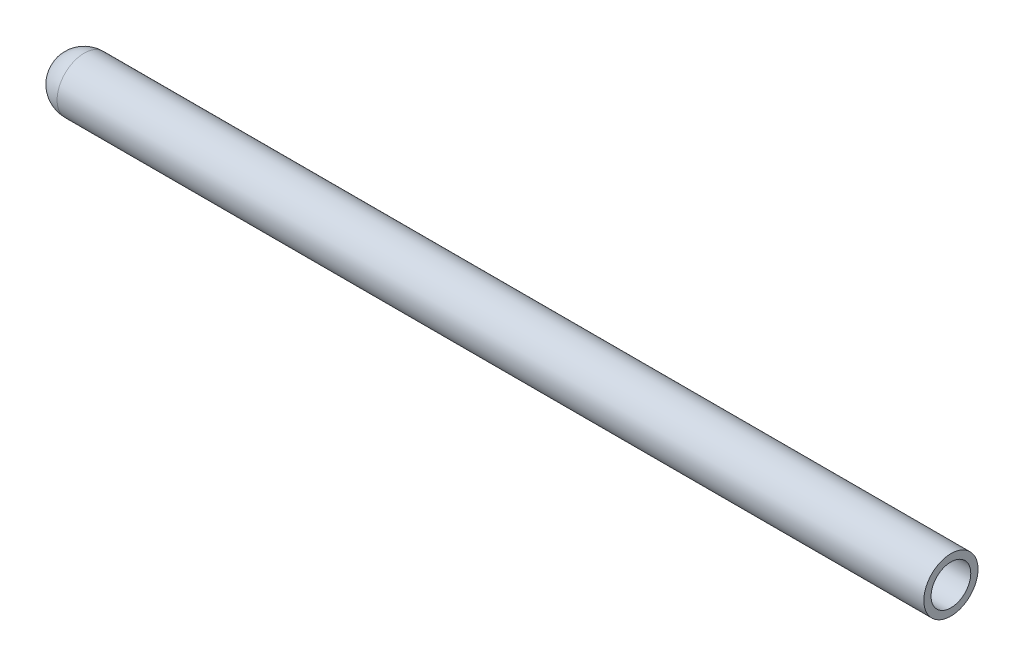
ISO-10303-21;
HEADER;
FILE_DESCRIPTION(('STEP AP214'),'2;1');
FILE_NAME('part.step','',(''),(''),'','','');
FILE_SCHEMA(('AUTOMOTIVE_DESIGN { 1 0 10303 214 1 1 1 1 }'));
ENDSEC;
DATA;
#1=APPLICATION_CONTEXT('core data for automotive mechanical design processes');
#2=APPLICATION_PROTOCOL_DEFINITION('international standard','automotive_design',2000,#1);
#3=PRODUCT_CONTEXT('',#1,'mechanical');
#4=PRODUCT('Part','Part','',(#3));
#5=PRODUCT_RELATED_PRODUCT_CATEGORY('part','',(#4));
#6=PRODUCT_DEFINITION_FORMATION('','',#4);
#7=PRODUCT_DEFINITION_CONTEXT('part definition',#1,'design');
#8=PRODUCT_DEFINITION('design','',#6,#7);
#9=PRODUCT_DEFINITION_SHAPE('','',#8);
#10=(LENGTH_UNIT() NAMED_UNIT(*) SI_UNIT(.MILLI.,.METRE.));
#11=(NAMED_UNIT(*) PLANE_ANGLE_UNIT() SI_UNIT($,.RADIAN.));
#12=(NAMED_UNIT(*) SI_UNIT($,.STERADIAN.) SOLID_ANGLE_UNIT());
#13=UNCERTAINTY_MEASURE_WITH_UNIT(LENGTH_MEASURE(1.E-05),#10,'distance_accuracy_value','');
#14=(GEOMETRIC_REPRESENTATION_CONTEXT(3) GLOBAL_UNCERTAINTY_ASSIGNED_CONTEXT((#13)) GLOBAL_UNIT_ASSIGNED_CONTEXT((#10,
#11,#12)) REPRESENTATION_CONTEXT('',''));
#15=CARTESIAN_POINT('',(0.,0.,0.));
#16=DIRECTION('',(0.,0.,1.));
#17=DIRECTION('',(1.,0.,0.));
#18=AXIS2_PLACEMENT_3D('',#15,#16,#17);
#19=CARTESIAN_POINT('',(-304.8,0.,0.));
#20=DIRECTION('',(1.,0.,0.));
#21=DIRECTION('',(0.,0.,-1.));
#22=AXIS2_PLACEMENT_3D('',#19,#20,#21);
#23=CYLINDRICAL_SURFACE('',#22,9.525);
#24=CARTESIAN_POINT('',(-304.8,0.,0.));
#25=DIRECTION('',(1.,0.,0.));
#26=DIRECTION('',(0.,0.,-1.));
#27=AXIS2_PLACEMENT_3D('',#24,#25,#26);
#28=CIRCLE('',#27,9.525);
#29=CARTESIAN_POINT('',(-304.8,0.,-9.525));
#30=VERTEX_POINT('',#29);
#31=EDGE_CURVE('E10',#30,#30,#28,.T.);
#32=CARTESIAN_POINT('',(0.,0.,0.));
#33=DIRECTION('',(1.,0.,0.));
#34=DIRECTION('',(0.,0.,-1.));
#35=AXIS2_PLACEMENT_3D('',#32,#33,#34);
#36=CIRCLE('',#35,9.525);
#37=CARTESIAN_POINT('',(0.,0.,-9.525));
#38=VERTEX_POINT('',#37);
#39=EDGE_CURVE('E38',#38,#38,#36,.T.);
#40=CARTESIAN_POINT('',(-304.8,0.,-9.525));
#41=CARTESIAN_POINT('',(-301.625,0.,-9.525));
#42=CARTESIAN_POINT('',(-298.45,0.,-9.525));
#43=CARTESIAN_POINT('',(-292.1,0.,-9.525));
#44=CARTESIAN_POINT('',(-288.925,0.,-9.525));
#45=CARTESIAN_POINT('',(-282.575,0.,-9.525));
#46=CARTESIAN_POINT('',(-279.4,0.,-9.525));
#47=CARTESIAN_POINT('',(-273.05,0.,-9.525));
#48=CARTESIAN_POINT('',(-269.875,0.,-9.525));
#49=CARTESIAN_POINT('',(-263.525,0.,-9.525));
#50=CARTESIAN_POINT('',(-260.35,0.,-9.525));
#51=CARTESIAN_POINT('',(-254.,0.,-9.525));
#52=CARTESIAN_POINT('',(-250.825,0.,-9.525));
#53=CARTESIAN_POINT('',(-244.475,0.,-9.525));
#54=CARTESIAN_POINT('',(-241.3,0.,-9.525));
#55=CARTESIAN_POINT('',(-234.95,0.,-9.525));
#56=CARTESIAN_POINT('',(-231.775,0.,-9.525));
#57=CARTESIAN_POINT('',(-225.425,0.,-9.525));
#58=CARTESIAN_POINT('',(-222.25,0.,-9.525));
#59=CARTESIAN_POINT('',(-215.9,0.,-9.525));
#60=CARTESIAN_POINT('',(-212.725,0.,-9.525));
#61=CARTESIAN_POINT('',(-206.375,0.,-9.525));
#62=CARTESIAN_POINT('',(-203.2,0.,-9.525));
#63=CARTESIAN_POINT('',(-196.85,0.,-9.525));
#64=CARTESIAN_POINT('',(-193.675,0.,-9.525));
#65=CARTESIAN_POINT('',(-187.325,0.,-9.525));
#66=CARTESIAN_POINT('',(-184.15,0.,-9.525));
#67=CARTESIAN_POINT('',(-177.8,0.,-9.525));
#68=CARTESIAN_POINT('',(-174.625,0.,-9.525));
#69=CARTESIAN_POINT('',(-168.275,0.,-9.525));
#70=CARTESIAN_POINT('',(-165.1,0.,-9.525));
#71=CARTESIAN_POINT('',(-158.75,0.,-9.525));
#72=CARTESIAN_POINT('',(-155.575,0.,-9.525));
#73=CARTESIAN_POINT('',(-149.225,0.,-9.525));
#74=CARTESIAN_POINT('',(-146.05,0.,-9.525));
#75=CARTESIAN_POINT('',(-139.7,0.,-9.525));
#76=CARTESIAN_POINT('',(-136.525,0.,-9.525));
#77=CARTESIAN_POINT('',(-130.175,0.,-9.525));
#78=CARTESIAN_POINT('',(-127.,0.,-9.525));
#79=CARTESIAN_POINT('',(-120.65,0.,-9.525));
#80=CARTESIAN_POINT('',(-117.475,0.,-9.525));
#81=CARTESIAN_POINT('',(-111.125,0.,-9.525));
#82=CARTESIAN_POINT('',(-107.95,0.,-9.525));
#83=CARTESIAN_POINT('',(-101.6,0.,-9.525));
#84=CARTESIAN_POINT('',(-98.425,0.,-9.525));
#85=CARTESIAN_POINT('',(-92.075,0.,-9.525));
#86=CARTESIAN_POINT('',(-88.9,0.,-9.525));
#87=CARTESIAN_POINT('',(-82.55,0.,-9.525));
#88=CARTESIAN_POINT('',(-79.375,0.,-9.525));
#89=CARTESIAN_POINT('',(-73.025,0.,-9.525));
#90=CARTESIAN_POINT('',(-69.85,0.,-9.525));
#91=CARTESIAN_POINT('',(-63.5,0.,-9.525));
#92=CARTESIAN_POINT('',(-60.325,0.,-9.525));
#93=CARTESIAN_POINT('',(-53.975,0.,-9.525));
#94=CARTESIAN_POINT('',(-50.8,0.,-9.525));
#95=CARTESIAN_POINT('',(-44.45,0.,-9.525));
#96=CARTESIAN_POINT('',(-41.275,0.,-9.525));
#97=CARTESIAN_POINT('',(-34.925,0.,-9.525));
#98=CARTESIAN_POINT('',(-31.75,0.,-9.525));
#99=CARTESIAN_POINT('',(-25.4,0.,-9.525));
#100=CARTESIAN_POINT('',(-22.225,0.,-9.525));
#101=CARTESIAN_POINT('',(-15.875,0.,-9.525));
#102=CARTESIAN_POINT('',(-12.7,0.,-9.525));
#103=CARTESIAN_POINT('',(-6.35,0.,-9.525));
#104=CARTESIAN_POINT('',(-3.175,0.,-9.525));
#105=CARTESIAN_POINT('',(0.,0.,-9.525));
#106=B_SPLINE_CURVE_WITH_KNOTS('',3,(#40,#41,#42,#43,#44,#45,#46,#47,#48,#49,#50,#51,#52,#53,
#54,#55,#56,#57,#58,#59,#60,#61,#62,#63,#64,#65,#66,#67,#68,#69,#70,#71,#72,#73,#74,#75,#76,#77,
#78,#79,#80,#81,#82,#83,#84,#85,#86,#87,#88,#89,#90,#91,#92,#93,#94,#95,#96,#97,#98,#99,#100,
#101,#102,#103,#104,#105),.UNSPECIFIED.,.F.,.F.,(4,2,2,2,2,2,2,2,2,2,2,2,2,2,2,2,2,2,2,2,2,2,2,
2,2,2,2,2,2,2,2,2,4),(0.,9.52500000000001,19.05,28.575,38.1,47.625,57.15,66.675,76.2,
85.7250000000001,95.2500000000001,104.775,114.3,123.825,133.35,142.875,152.4,161.925,171.45,
180.975,190.5,200.025,209.55,219.075,228.6,238.125,247.65,257.175,266.7,276.225,285.75,295.275,
304.8),.UNSPECIFIED.);
#107=EDGE_CURVE('BSEAM31',#30,#38,#106,.T.);
#108=ORIENTED_EDGE('',*,*,#31,.T.);
#109=ORIENTED_EDGE('',*,*,#39,.F.);
#110=ORIENTED_EDGE('',*,*,#107,.T.);
#111=ORIENTED_EDGE('',*,*,#107,.F.);
#112=EDGE_LOOP('',(#108,#110,#109,#111));
#113=FACE_BOUND('',#112,.T.);
#114=ADVANCED_FACE('F31',(#113),#23,.T.);
#115=CARTESIAN_POINT('',(-304.8,0.,0.));
#116=DIRECTION('',(0.,0.,1.));
#117=DIRECTION('',(1.,0.,0.));
#118=AXIS2_PLACEMENT_3D('',#115,#116,#117);
#119=SPHERICAL_SURFACE('',#118,9.525);
#120=CARTESIAN_POINT('',(-304.8,0.,0.));
#121=DIRECTION('',(1.,0.,0.));
#122=DIRECTION('',(0.,0.,-1.));
#123=AXIS2_PLACEMENT_3D('',#120,#121,#122);
#124=SPHERICAL_SURFACE('',#123,9.525);
#125=ORIENTED_EDGE('',*,*,#31,.F.);
#126=EDGE_LOOP('',(#125));
#127=FACE_BOUND('',#126,.T.);
#128=ADVANCED_FACE('F33',(#127),#124,.T.);
#129=CARTESIAN_POINT('',(0.,0.,0.));
#130=DIRECTION('',(1.,0.,0.));
#131=DIRECTION('',(0.,0.,-1.));
#132=AXIS2_PLACEMENT_3D('',#129,#130,#131);
#133=PLANE('',#132);
#134=CARTESIAN_POINT('',(0.,0.,0.));
#135=DIRECTION('',(1.,0.,0.));
#136=DIRECTION('',(0.,0.,-1.));
#137=AXIS2_PLACEMENT_3D('',#134,#135,#136);
#138=CIRCLE('',#137,6.985);
#139=CARTESIAN_POINT('',(0.,0.,-6.985));
#140=VERTEX_POINT('',#139);
#141=EDGE_CURVE('E46',#140,#140,#138,.T.);
#142=ORIENTED_EDGE('',*,*,#141,.F.);
#143=EDGE_LOOP('',(#142));
#144=FACE_BOUND('',#143,.T.);
#145=ORIENTED_EDGE('',*,*,#39,.T.);
#146=EDGE_LOOP('',(#145));
#147=FACE_BOUND('',#146,.T.);
#148=ADVANCED_FACE('F54',(#144,#147),#133,.T.);
#149=CARTESIAN_POINT('',(-304.8,0.,0.));
#150=DIRECTION('',(1.,0.,0.));
#151=DIRECTION('',(0.,0.,-1.));
#152=AXIS2_PLACEMENT_3D('',#149,#150,#151);
#153=CYLINDRICAL_SURFACE('',#152,6.985);
#154=CARTESIAN_POINT('',(-304.8,0.,0.));
#155=DIRECTION('',(1.,0.,0.));
#156=DIRECTION('',(0.,0.,-1.));
#157=AXIS2_PLACEMENT_3D('',#154,#155,#156);
#158=CIRCLE('',#157,6.985);
#159=CARTESIAN_POINT('',(-304.8,0.,-6.985));
#160=VERTEX_POINT('',#159);
#161=EDGE_CURVE('E42',#160,#160,#158,.T.);
#162=CARTESIAN_POINT('',(-304.8,0.,-6.985));
#163=CARTESIAN_POINT('',(-301.625,0.,-6.985));
#164=CARTESIAN_POINT('',(-298.45,0.,-6.985));
#165=CARTESIAN_POINT('',(-292.1,0.,-6.985));
#166=CARTESIAN_POINT('',(-288.925,0.,-6.985));
#167=CARTESIAN_POINT('',(-282.575,0.,-6.985));
#168=CARTESIAN_POINT('',(-279.4,0.,-6.985));
#169=CARTESIAN_POINT('',(-273.05,0.,-6.985));
#170=CARTESIAN_POINT('',(-269.875,0.,-6.985));
#171=CARTESIAN_POINT('',(-263.525,0.,-6.985));
#172=CARTESIAN_POINT('',(-260.35,0.,-6.985));
#173=CARTESIAN_POINT('',(-254.,0.,-6.985));
#174=CARTESIAN_POINT('',(-250.825,0.,-6.985));
#175=CARTESIAN_POINT('',(-244.475,0.,-6.985));
#176=CARTESIAN_POINT('',(-241.3,0.,-6.985));
#177=CARTESIAN_POINT('',(-234.95,0.,-6.985));
#178=CARTESIAN_POINT('',(-231.775,0.,-6.985));
#179=CARTESIAN_POINT('',(-225.425,0.,-6.985));
#180=CARTESIAN_POINT('',(-222.25,0.,-6.985));
#181=CARTESIAN_POINT('',(-215.9,0.,-6.985));
#182=CARTESIAN_POINT('',(-212.725,0.,-6.985));
#183=CARTESIAN_POINT('',(-206.375,0.,-6.985));
#184=CARTESIAN_POINT('',(-203.2,0.,-6.985));
#185=CARTESIAN_POINT('',(-196.85,0.,-6.985));
#186=CARTESIAN_POINT('',(-193.675,0.,-6.985));
#187=CARTESIAN_POINT('',(-187.325,0.,-6.985));
#188=CARTESIAN_POINT('',(-184.15,0.,-6.985));
#189=CARTESIAN_POINT('',(-177.8,0.,-6.985));
#190=CARTESIAN_POINT('',(-174.625,0.,-6.985));
#191=CARTESIAN_POINT('',(-168.275,0.,-6.985));
#192=CARTESIAN_POINT('',(-165.1,0.,-6.985));
#193=CARTESIAN_POINT('',(-158.75,0.,-6.985));
#194=CARTESIAN_POINT('',(-155.575,0.,-6.985));
#195=CARTESIAN_POINT('',(-149.225,0.,-6.985));
#196=CARTESIAN_POINT('',(-146.05,0.,-6.985));
#197=CARTESIAN_POINT('',(-139.7,0.,-6.985));
#198=CARTESIAN_POINT('',(-136.525,0.,-6.985));
#199=CARTESIAN_POINT('',(-130.175,0.,-6.985));
#200=CARTESIAN_POINT('',(-127.,0.,-6.985));
#201=CARTESIAN_POINT('',(-120.65,0.,-6.985));
#202=CARTESIAN_POINT('',(-117.475,0.,-6.985));
#203=CARTESIAN_POINT('',(-111.125,0.,-6.985));
#204=CARTESIAN_POINT('',(-107.95,0.,-6.985));
#205=CARTESIAN_POINT('',(-101.6,0.,-6.985));
#206=CARTESIAN_POINT('',(-98.425,0.,-6.985));
#207=CARTESIAN_POINT('',(-92.075,0.,-6.985));
#208=CARTESIAN_POINT('',(-88.9,0.,-6.985));
#209=CARTESIAN_POINT('',(-82.55,0.,-6.985));
#210=CARTESIAN_POINT('',(-79.375,0.,-6.985));
#211=CARTESIAN_POINT('',(-73.025,0.,-6.985));
#212=CARTESIAN_POINT('',(-69.85,0.,-6.985));
#213=CARTESIAN_POINT('',(-63.5,0.,-6.985));
#214=CARTESIAN_POINT('',(-60.325,0.,-6.985));
#215=CARTESIAN_POINT('',(-53.975,0.,-6.985));
#216=CARTESIAN_POINT('',(-50.8,0.,-6.985));
#217=CARTESIAN_POINT('',(-44.45,0.,-6.985));
#218=CARTESIAN_POINT('',(-41.275,0.,-6.985));
#219=CARTESIAN_POINT('',(-34.925,0.,-6.985));
#220=CARTESIAN_POINT('',(-31.75,0.,-6.985));
#221=CARTESIAN_POINT('',(-25.4,0.,-6.985));
#222=CARTESIAN_POINT('',(-22.225,0.,-6.985));
#223=CARTESIAN_POINT('',(-15.875,0.,-6.985));
#224=CARTESIAN_POINT('',(-12.7,0.,-6.985));
#225=CARTESIAN_POINT('',(-6.35,0.,-6.985));
#226=CARTESIAN_POINT('',(-3.175,0.,-6.985));
#227=CARTESIAN_POINT('',(0.,0.,-6.985));
#228=B_SPLINE_CURVE_WITH_KNOTS('',3,(#162,#163,#164,#165,#166,#167,#168,#169,#170,#171,#172,
#173,#174,#175,#176,#177,#178,#179,#180,#181,#182,#183,#184,#185,#186,#187,#188,#189,#190,#191,
#192,#193,#194,#195,#196,#197,#198,#199,#200,#201,#202,#203,#204,#205,#206,#207,#208,#209,#210,
#211,#212,#213,#214,#215,#216,#217,#218,#219,#220,#221,#222,#223,#224,#225,#226,#227),
.UNSPECIFIED.,.F.,.F.,(4,2,2,2,2,2,2,2,2,2,2,2,2,2,2,2,2,2,2,2,2,2,2,2,2,2,2,2,2,2,2,2,4),(0.,
9.52499999999995,19.05,28.575,38.1,47.625,57.15,66.675,76.2,85.725,95.25,104.775,114.3,123.825,
133.35,142.875,152.4,161.925,171.45,180.975,190.5,200.025,209.55,219.075,228.6,238.125,247.65,
257.175,266.7,276.225,285.75,295.275,304.8),.UNSPECIFIED.);
#229=EDGE_CURVE('BSEAM52',#160,#140,#228,.T.);
#230=ORIENTED_EDGE('',*,*,#161,.F.);
#231=ORIENTED_EDGE('',*,*,#141,.T.);
#232=ORIENTED_EDGE('',*,*,#229,.T.);
#233=ORIENTED_EDGE('',*,*,#229,.F.);
#234=EDGE_LOOP('',(#230,#232,#231,#233));
#235=FACE_BOUND('',#234,.T.);
#236=ADVANCED_FACE('F52',(#235),#153,.F.);
#237=CARTESIAN_POINT('',(-304.8,0.,0.));
#238=DIRECTION('',(0.,0.,1.));
#239=DIRECTION('',(1.,0.,0.));
#240=AXIS2_PLACEMENT_3D('',#237,#238,#239);
#241=SPHERICAL_SURFACE('',#240,6.985);
#242=CARTESIAN_POINT('',(-304.8,0.,0.));
#243=DIRECTION('',(1.,0.,0.));
#244=DIRECTION('',(0.,0.,-1.));
#245=AXIS2_PLACEMENT_3D('',#242,#243,#244);
#246=SPHERICAL_SURFACE('',#245,6.985);
#247=ORIENTED_EDGE('',*,*,#161,.T.);
#248=EDGE_LOOP('',(#247));
#249=FACE_BOUND('',#248,.T.);
#250=ADVANCED_FACE('F61',(#249),#246,.F.);
#251=CLOSED_SHELL('',(#114,#128,#148,#236,#250));
#252=MANIFOLD_SOLID_BREP('B2',#251);
#253=ADVANCED_BREP_SHAPE_REPRESENTATION('',(#18,#252),#14);
#254=SHAPE_DEFINITION_REPRESENTATION(#9,#253);
ENDSEC;
END-ISO-10303-21;
